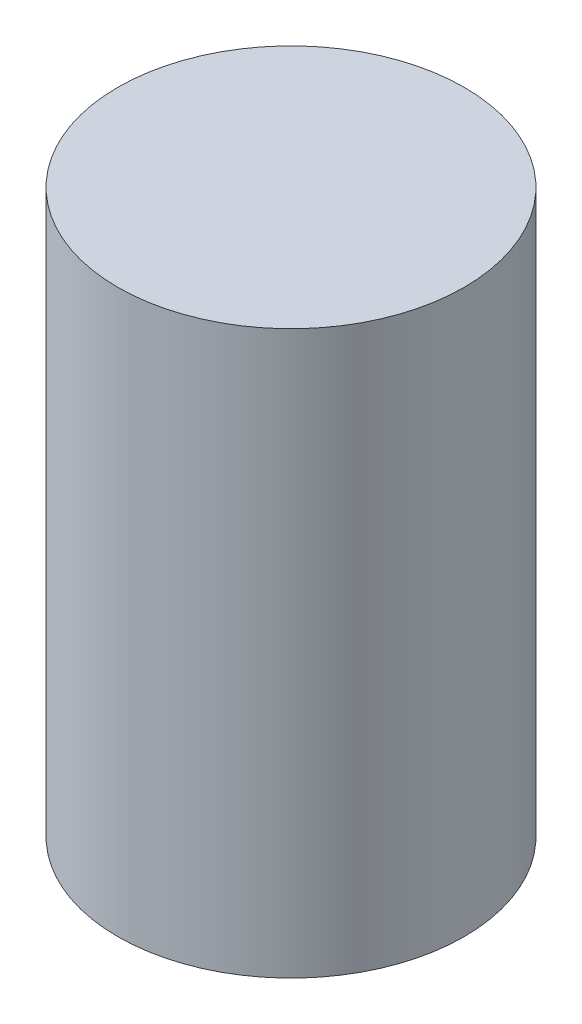
ISO-10303-21;
HEADER;
FILE_DESCRIPTION(('STEP AP214'),'2;1');
FILE_NAME('part.step','',(''),(''),'','','');
FILE_SCHEMA(('AUTOMOTIVE_DESIGN { 1 0 10303 214 1 1 1 1 }'));
ENDSEC;
DATA;
#1=APPLICATION_CONTEXT('core data for automotive mechanical design processes');
#2=APPLICATION_PROTOCOL_DEFINITION('international standard','automotive_design',2000,#1);
#3=PRODUCT_CONTEXT('',#1,'mechanical');
#4=PRODUCT('Part','Part','',(#3));
#5=PRODUCT_RELATED_PRODUCT_CATEGORY('part','',(#4));
#6=PRODUCT_DEFINITION_FORMATION('','',#4);
#7=PRODUCT_DEFINITION_CONTEXT('part definition',#1,'design');
#8=PRODUCT_DEFINITION('design','',#6,#7);
#9=PRODUCT_DEFINITION_SHAPE('','',#8);
#10=(LENGTH_UNIT() NAMED_UNIT(*) SI_UNIT(.MILLI.,.METRE.));
#11=(NAMED_UNIT(*) PLANE_ANGLE_UNIT() SI_UNIT($,.RADIAN.));
#12=(NAMED_UNIT(*) SI_UNIT($,.STERADIAN.) SOLID_ANGLE_UNIT());
#13=UNCERTAINTY_MEASURE_WITH_UNIT(LENGTH_MEASURE(1.E-05),#10,'distance_accuracy_value','');
#14=(GEOMETRIC_REPRESENTATION_CONTEXT(3) GLOBAL_UNCERTAINTY_ASSIGNED_CONTEXT((#13)) GLOBAL_UNIT_ASSIGNED_CONTEXT((#10,
#11,#12)) REPRESENTATION_CONTEXT('',''));
#15=CARTESIAN_POINT('',(0.,0.,0.));
#16=DIRECTION('',(0.,0.,1.));
#17=DIRECTION('',(1.,0.,0.));
#18=AXIS2_PLACEMENT_3D('',#15,#16,#17);
#19=CARTESIAN_POINT('',(0.,25.,0.));
#20=DIRECTION('',(0.,-1.,0.));
#21=DIRECTION('',(0.,0.,-1.));
#22=AXIS2_PLACEMENT_3D('',#19,#20,#21);
#23=CYLINDRICAL_SURFACE('',#22,7.7);
#24=CARTESIAN_POINT('',(0.,25.,0.));
#25=DIRECTION('',(0.,1.,0.));
#26=DIRECTION('',(0.,0.,1.));
#27=AXIS2_PLACEMENT_3D('',#24,#25,#26);
#28=CIRCLE('',#27,7.7);
#29=CARTESIAN_POINT('',(0.,25.,7.7));
#30=VERTEX_POINT('',#29);
#31=EDGE_CURVE('E10',#30,#30,#28,.T.);
#32=ORIENTED_EDGE('',*,*,#31,.F.);
#33=EDGE_LOOP('',(#32));
#34=FACE_BOUND('',#33,.T.);
#35=CARTESIAN_POINT('',(0.,0.,0.));
#36=DIRECTION('',(0.,1.,0.));
#37=DIRECTION('',(0.,0.,1.));
#38=AXIS2_PLACEMENT_3D('',#35,#36,#37);
#39=CIRCLE('',#38,7.7);
#40=CARTESIAN_POINT('',(0.,0.,7.7));
#41=VERTEX_POINT('',#40);
#42=EDGE_CURVE('E33',#41,#41,#39,.T.);
#43=ORIENTED_EDGE('',*,*,#42,.T.);
#44=EDGE_LOOP('',(#43));
#45=FACE_BOUND('',#44,.T.);
#46=ADVANCED_FACE('F30',(#34,#45),#23,.T.);
#47=CARTESIAN_POINT('',(0.,25.,0.));
#48=DIRECTION('',(0.,1.,0.));
#49=DIRECTION('',(0.,0.,1.));
#50=AXIS2_PLACEMENT_3D('',#47,#48,#49);
#51=PLANE('',#50);
#52=ORIENTED_EDGE('',*,*,#31,.T.);
#53=EDGE_LOOP('',(#52));
#54=FACE_BOUND('',#53,.T.);
#55=ADVANCED_FACE('F45',(#54),#51,.T.);
#56=CARTESIAN_POINT('',(0.,0.,0.));
#57=DIRECTION('',(0.,1.,0.));
#58=DIRECTION('',(0.,0.,1.));
#59=AXIS2_PLACEMENT_3D('',#56,#57,#58);
#60=PLANE('',#59);
#61=ORIENTED_EDGE('',*,*,#42,.F.);
#62=EDGE_LOOP('',(#61));
#63=FACE_BOUND('',#62,.T.);
#64=ADVANCED_FACE('F43',(#63),#60,.F.);
#65=CLOSED_SHELL('',(#46,#55,#64));
#66=MANIFOLD_SOLID_BREP('B2',#65);
#67=ADVANCED_BREP_SHAPE_REPRESENTATION('',(#18,#66),#14);
#68=SHAPE_DEFINITION_REPRESENTATION(#9,#67);
ENDSEC;
END-ISO-10303-21;
